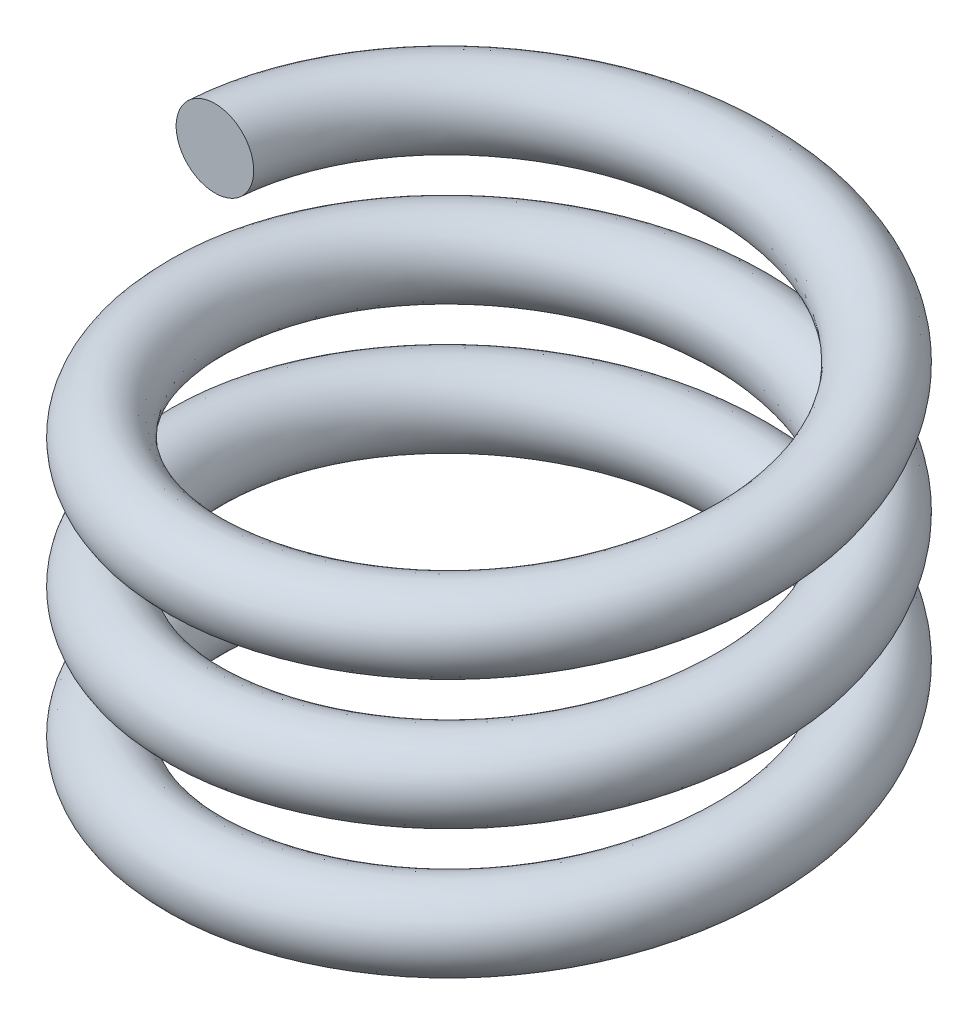
ISO-10303-21;
HEADER;
FILE_DESCRIPTION(('STEP AP214'),'2;1');
FILE_NAME('part.step','',(''),(''),'','','');
FILE_SCHEMA(('AUTOMOTIVE_DESIGN { 1 0 10303 214 1 1 1 1 }'));
ENDSEC;
DATA;
#1=APPLICATION_CONTEXT('core data for automotive mechanical design processes');
#2=APPLICATION_PROTOCOL_DEFINITION('international standard','automotive_design',2000,#1);
#3=PRODUCT_CONTEXT('',#1,'mechanical');
#4=PRODUCT('Part','Part','',(#3));
#5=PRODUCT_RELATED_PRODUCT_CATEGORY('part','',(#4));
#6=PRODUCT_DEFINITION_FORMATION('','',#4);
#7=PRODUCT_DEFINITION_CONTEXT('part definition',#1,'design');
#8=PRODUCT_DEFINITION('design','',#6,#7);
#9=PRODUCT_DEFINITION_SHAPE('','',#8);
#10=(LENGTH_UNIT() NAMED_UNIT(*) SI_UNIT(.MILLI.,.METRE.));
#11=(NAMED_UNIT(*) PLANE_ANGLE_UNIT() SI_UNIT($,.RADIAN.));
#12=(NAMED_UNIT(*) SI_UNIT($,.STERADIAN.) SOLID_ANGLE_UNIT());
#13=UNCERTAINTY_MEASURE_WITH_UNIT(LENGTH_MEASURE(1.E-05),#10,'distance_accuracy_value','');
#14=(GEOMETRIC_REPRESENTATION_CONTEXT(3) GLOBAL_UNCERTAINTY_ASSIGNED_CONTEXT((#13)) GLOBAL_UNIT_ASSIGNED_CONTEXT((#10,
#11,#12)) REPRESENTATION_CONTEXT('',''));
#15=CARTESIAN_POINT('',(0.,0.,0.));
#16=DIRECTION('',(0.,0.,1.));
#17=DIRECTION('',(1.,0.,0.));
#18=AXIS2_PLACEMENT_3D('',#15,#16,#17);
#19=CARTESIAN_POINT('',(-2.6924,0.,0.));
#20=DIRECTION('',(0.,0.,1.));
#21=DIRECTION('',(1.,0.,0.));
#22=AXIS2_PLACEMENT_3D('',#19,#20,#21);
#23=PLANE('',#22);
#24=CARTESIAN_POINT('',(-2.6924,0.,0.));
#25=DIRECTION('',(0.,0.,1.));
#26=DIRECTION('',(1.,0.,0.));
#27=AXIS2_PLACEMENT_3D('',#24,#25,#26);
#28=CIRCLE('',#27,0.381);
#29=CARTESIAN_POINT('',(-2.3114,0.,0.));
#30=VERTEX_POINT('',#29);
#31=EDGE_CURVE('E39',#30,#30,#28,.T.);
#32=ORIENTED_EDGE('',*,*,#31,.F.);
#33=EDGE_LOOP('',(#32));
#34=FACE_BOUND('',#33,.T.);
#35=ADVANCED_FACE('F32',(#34),#23,.F.);
#36=CARTESIAN_POINT('',(-2.6924,3.81,1.12805572280415E-13));
#37=DIRECTION('',(0.,0.,1.));
#38=DIRECTION('',(1.,0.,0.));
#39=AXIS2_PLACEMENT_3D('',#36,#37,#38);
#40=PLANE('',#39);
#41=CARTESIAN_POINT('',(-2.6924,3.81,1.12805572280415E-13));
#42=DIRECTION('',(0.,0.,1.));
#43=DIRECTION('',(1.,0.,0.));
#44=AXIS2_PLACEMENT_3D('',#41,#42,#43);
#45=CIRCLE('',#44,0.381);
#46=CARTESIAN_POINT('',(-2.3114,3.81,0.));
#47=VERTEX_POINT('',#46);
#48=EDGE_CURVE('E11',#47,#47,#45,.T.);
#49=ORIENTED_EDGE('',*,*,#48,.T.);
#50=EDGE_LOOP('',(#49));
#51=FACE_BOUND('',#50,.T.);
#52=ADVANCED_FACE('F46',(#51),#40,.T.);
#53=CARTESIAN_POINT('',(-2.3114,0.,0.));
#54=CARTESIAN_POINT('',(-2.3114,0.105833333333333,1.3344874122049));
#55=CARTESIAN_POINT('',(-1.1557,0.211666666666666,2.00173111830735));
#56=CARTESIAN_POINT('',(0.,0.317499999999999,2.6689748244098));
#57=CARTESIAN_POINT('',(1.1557,0.423333333333332,2.00173111830735));
#58=CARTESIAN_POINT('',(2.3114,0.529166666666665,1.3344874122049));
#59=CARTESIAN_POINT('',(2.3114,0.634999999999998,0.));
#60=CARTESIAN_POINT('',(2.3114,0.740833333333332,-1.3344874122049));
#61=CARTESIAN_POINT('',(1.1557,0.846666666666665,-2.00173111830735));
#62=CARTESIAN_POINT('',(0.,0.952499999999998,-2.6689748244098));
#63=CARTESIAN_POINT('',(-1.1557,1.05833333333333,-2.00173111830735));
#64=CARTESIAN_POINT('',(-2.3114,1.16416666666666,-1.3344874122049));
#65=CARTESIAN_POINT('',(-2.3114,1.27,0.));
#66=CARTESIAN_POINT('',(-2.3114,1.37583333333333,1.3344874122049));
#67=CARTESIAN_POINT('',(-1.1557,1.48166666666666,2.00173111830735));
#68=CARTESIAN_POINT('',(0.,1.5875,2.6689748244098));
#69=CARTESIAN_POINT('',(1.1557,1.69333333333333,2.00173111830735));
#70=CARTESIAN_POINT('',(2.3114,1.79916666666666,1.3344874122049));
#71=CARTESIAN_POINT('',(2.3114,1.905,0.));
#72=CARTESIAN_POINT('',(2.3114,2.01083333333333,-1.3344874122049));
#73=CARTESIAN_POINT('',(1.1557,2.11666666666666,-2.00173111830735));
#74=CARTESIAN_POINT('',(0.,2.22249999999999,-2.6689748244098));
#75=CARTESIAN_POINT('',(-1.1557,2.32833333333333,-2.00173111830735));
#76=CARTESIAN_POINT('',(-2.3114,2.43416666666666,-1.3344874122049));
#77=CARTESIAN_POINT('',(-2.3114,2.53999999999999,0.));
#78=CARTESIAN_POINT('',(-2.3114,2.64583333333333,1.3344874122049));
#79=CARTESIAN_POINT('',(-1.1557,2.75166666666666,2.00173111830735));
#80=CARTESIAN_POINT('',(0.,2.85749999999999,2.6689748244098));
#81=CARTESIAN_POINT('',(1.1557,2.96333333333333,2.00173111830735));
#82=CARTESIAN_POINT('',(2.3114,3.06916666666666,1.3344874122049));
#83=CARTESIAN_POINT('',(2.3114,3.17499999999999,0.));
#84=CARTESIAN_POINT('',(2.3114,3.28083333333333,-1.3344874122049));
#85=CARTESIAN_POINT('',(1.1557,3.38666666666666,-2.00173111830735));
#86=CARTESIAN_POINT('',(0.,3.49249999999999,-2.6689748244098));
#87=CARTESIAN_POINT('',(-1.1557,3.59833333333333,-2.00173111830735));
#88=CARTESIAN_POINT('',(-2.3114,3.70416666666666,-1.3344874122049));
#89=CARTESIAN_POINT('',(-2.3114,3.80999999999999,0.));
#90=CARTESIAN_POINT('',(-2.3114,0.761999999999999,0.));
#91=CARTESIAN_POINT('',(-2.3114,0.867833333333332,1.3344874122049));
#92=CARTESIAN_POINT('',(-1.1557,0.973666666666665,2.00173111830735));
#93=CARTESIAN_POINT('',(0.,1.0795,2.6689748244098));
#94=CARTESIAN_POINT('',(1.1557,1.18533333333333,2.00173111830735));
#95=CARTESIAN_POINT('',(2.3114,1.29116666666667,1.3344874122049));
#96=CARTESIAN_POINT('',(2.3114,1.397,0.));
#97=CARTESIAN_POINT('',(2.3114,1.50283333333333,-1.3344874122049));
#98=CARTESIAN_POINT('',(1.1557,1.60866666666666,-2.00173111830735));
#99=CARTESIAN_POINT('',(0.,1.7145,-2.6689748244098));
#100=CARTESIAN_POINT('',(-1.1557,1.82033333333333,-2.00173111830735));
#101=CARTESIAN_POINT('',(-2.3114,1.92616666666666,-1.3344874122049));
#102=CARTESIAN_POINT('',(-2.3114,2.032,0.));
#103=CARTESIAN_POINT('',(-2.3114,2.13783333333333,1.3344874122049));
#104=CARTESIAN_POINT('',(-1.1557,2.24366666666666,2.00173111830735));
#105=CARTESIAN_POINT('',(0.,2.3495,2.6689748244098));
#106=CARTESIAN_POINT('',(1.1557,2.45533333333333,2.00173111830735));
#107=CARTESIAN_POINT('',(2.3114,2.56116666666666,1.3344874122049));
#108=CARTESIAN_POINT('',(2.3114,2.667,0.));
#109=CARTESIAN_POINT('',(2.3114,2.77283333333333,-1.3344874122049));
#110=CARTESIAN_POINT('',(1.1557,2.87866666666666,-2.00173111830735));
#111=CARTESIAN_POINT('',(0.,2.98449999999999,-2.6689748244098));
#112=CARTESIAN_POINT('',(-1.1557,3.09033333333333,-2.00173111830735));
#113=CARTESIAN_POINT('',(-2.3114,3.19616666666666,-1.3344874122049));
#114=CARTESIAN_POINT('',(-2.3114,3.30199999999999,0.));
#115=CARTESIAN_POINT('',(-2.3114,3.40783333333333,1.3344874122049));
#116=CARTESIAN_POINT('',(-1.1557,3.51366666666666,2.00173111830735));
#117=CARTESIAN_POINT('',(0.,3.61949999999999,2.6689748244098));
#118=CARTESIAN_POINT('',(1.1557,3.72533333333333,2.00173111830735));
#119=CARTESIAN_POINT('',(2.3114,3.83116666666666,1.3344874122049));
#120=CARTESIAN_POINT('',(2.3114,3.93699999999999,0.));
#121=CARTESIAN_POINT('',(2.3114,4.04283333333333,-1.3344874122049));
#122=CARTESIAN_POINT('',(1.1557,4.14866666666666,-2.00173111830735));
#123=CARTESIAN_POINT('',(0.,4.25449999999999,-2.6689748244098));
#124=CARTESIAN_POINT('',(-1.1557,4.36033333333333,-2.00173111830735));
#125=CARTESIAN_POINT('',(-2.3114,4.46616666666666,-1.3344874122049));
#126=CARTESIAN_POINT('',(-2.3114,4.57199999999999,0.));
#127=CARTESIAN_POINT('',(-3.0734,0.761999999999999,0.));
#128=CARTESIAN_POINT('',(-3.0734,0.867833333333332,1.7744283173274));
#129=CARTESIAN_POINT('',(-1.5367,0.973666666666665,2.66164247599109));
#130=CARTESIAN_POINT('',(0.,1.0795,3.54885663465479));
#131=CARTESIAN_POINT('',(1.5367,1.18533333333333,2.66164247599109));
#132=CARTESIAN_POINT('',(3.0734,1.29116666666667,1.7744283173274));
#133=CARTESIAN_POINT('',(3.0734,1.397,0.));
#134=CARTESIAN_POINT('',(3.0734,1.50283333333333,-1.77442831732739));
#135=CARTESIAN_POINT('',(1.5367,1.60866666666666,-2.66164247599109));
#136=CARTESIAN_POINT('',(0.,1.7145,-3.54885663465479));
#137=CARTESIAN_POINT('',(-1.5367,1.82033333333333,-2.66164247599109));
#138=CARTESIAN_POINT('',(-3.0734,1.92616666666666,-1.7744283173274));
#139=CARTESIAN_POINT('',(-3.0734,2.032,0.));
#140=CARTESIAN_POINT('',(-3.0734,2.13783333333333,1.7744283173274));
#141=CARTESIAN_POINT('',(-1.5367,2.24366666666666,2.66164247599109));
#142=CARTESIAN_POINT('',(0.,2.3495,3.54885663465479));
#143=CARTESIAN_POINT('',(1.5367,2.45533333333333,2.66164247599109));
#144=CARTESIAN_POINT('',(3.0734,2.56116666666666,1.7744283173274));
#145=CARTESIAN_POINT('',(3.0734,2.667,0.));
#146=CARTESIAN_POINT('',(3.0734,2.77283333333333,-1.77442831732739));
#147=CARTESIAN_POINT('',(1.5367,2.87866666666666,-2.66164247599109));
#148=CARTESIAN_POINT('',(0.,2.98449999999999,-3.54885663465479));
#149=CARTESIAN_POINT('',(-1.5367,3.09033333333333,-2.66164247599109));
#150=CARTESIAN_POINT('',(-3.0734,3.19616666666666,-1.7744283173274));
#151=CARTESIAN_POINT('',(-3.0734,3.30199999999999,0.));
#152=CARTESIAN_POINT('',(-3.0734,3.40783333333333,1.7744283173274));
#153=CARTESIAN_POINT('',(-1.5367,3.51366666666666,2.66164247599109));
#154=CARTESIAN_POINT('',(0.,3.61949999999999,3.54885663465479));
#155=CARTESIAN_POINT('',(1.5367,3.72533333333333,2.66164247599109));
#156=CARTESIAN_POINT('',(3.0734,3.83116666666666,1.7744283173274));
#157=CARTESIAN_POINT('',(3.0734,3.93699999999999,0.));
#158=CARTESIAN_POINT('',(3.0734,4.04283333333333,-1.77442831732739));
#159=CARTESIAN_POINT('',(1.5367,4.14866666666666,-2.66164247599109));
#160=CARTESIAN_POINT('',(0.,4.25449999999999,-3.54885663465479));
#161=CARTESIAN_POINT('',(-1.5367,4.36033333333333,-2.66164247599109));
#162=CARTESIAN_POINT('',(-3.0734,4.46616666666666,-1.7744283173274));
#163=CARTESIAN_POINT('',(-3.0734,4.57199999999999,0.));
#164=CARTESIAN_POINT('',(-3.0734,0.,0.));
#165=CARTESIAN_POINT('',(-3.0734,0.105833333333333,1.77442831732739));
#166=CARTESIAN_POINT('',(-1.5367,0.211666666666666,2.66164247599109));
#167=CARTESIAN_POINT('',(0.,0.317499999999999,3.54885663465479));
#168=CARTESIAN_POINT('',(1.5367,0.423333333333332,2.66164247599109));
#169=CARTESIAN_POINT('',(3.0734,0.529166666666665,1.7744283173274));
#170=CARTESIAN_POINT('',(3.0734,0.634999999999998,0.));
#171=CARTESIAN_POINT('',(3.0734,0.740833333333332,-1.77442831732739));
#172=CARTESIAN_POINT('',(1.5367,0.846666666666665,-2.66164247599109));
#173=CARTESIAN_POINT('',(0.,0.952499999999998,-3.54885663465479));
#174=CARTESIAN_POINT('',(-1.5367,1.05833333333333,-2.66164247599109));
#175=CARTESIAN_POINT('',(-3.0734,1.16416666666666,-1.7744283173274));
#176=CARTESIAN_POINT('',(-3.0734,1.27,0.));
#177=CARTESIAN_POINT('',(-3.0734,1.37583333333333,1.77442831732739));
#178=CARTESIAN_POINT('',(-1.5367,1.48166666666666,2.66164247599109));
#179=CARTESIAN_POINT('',(0.,1.5875,3.54885663465479));
#180=CARTESIAN_POINT('',(1.5367,1.69333333333333,2.66164247599109));
#181=CARTESIAN_POINT('',(3.0734,1.79916666666666,1.7744283173274));
#182=CARTESIAN_POINT('',(3.0734,1.905,0.));
#183=CARTESIAN_POINT('',(3.0734,2.01083333333333,-1.77442831732739));
#184=CARTESIAN_POINT('',(1.5367,2.11666666666666,-2.66164247599109));
#185=CARTESIAN_POINT('',(0.,2.22249999999999,-3.54885663465479));
#186=CARTESIAN_POINT('',(-1.5367,2.32833333333333,-2.66164247599109));
#187=CARTESIAN_POINT('',(-3.0734,2.43416666666666,-1.7744283173274));
#188=CARTESIAN_POINT('',(-3.0734,2.53999999999999,0.));
#189=CARTESIAN_POINT('',(-3.0734,2.64583333333333,1.77442831732739));
#190=CARTESIAN_POINT('',(-1.5367,2.75166666666666,2.66164247599109));
#191=CARTESIAN_POINT('',(0.,2.85749999999999,3.54885663465479));
#192=CARTESIAN_POINT('',(1.5367,2.96333333333333,2.66164247599109));
#193=CARTESIAN_POINT('',(3.0734,3.06916666666666,1.7744283173274));
#194=CARTESIAN_POINT('',(3.0734,3.17499999999999,0.));
#195=CARTESIAN_POINT('',(3.0734,3.28083333333333,-1.77442831732739));
#196=CARTESIAN_POINT('',(1.5367,3.38666666666666,-2.66164247599109));
#197=CARTESIAN_POINT('',(0.,3.49249999999999,-3.54885663465479));
#198=CARTESIAN_POINT('',(-1.5367,3.59833333333333,-2.66164247599109));
#199=CARTESIAN_POINT('',(-3.0734,3.70416666666666,-1.7744283173274));
#200=CARTESIAN_POINT('',(-3.0734,3.80999999999999,0.));
#201=CARTESIAN_POINT('',(-3.0734,-0.762,0.));
#202=CARTESIAN_POINT('',(-3.0734,-0.656166666666667,1.7744283173274));
#203=CARTESIAN_POINT('',(-1.5367,-0.550333333333334,2.66164247599109));
#204=CARTESIAN_POINT('',(0.,-0.4445,3.54885663465479));
#205=CARTESIAN_POINT('',(1.5367,-0.338666666666667,2.66164247599109));
#206=CARTESIAN_POINT('',(3.0734,-0.232833333333334,1.7744283173274));
#207=CARTESIAN_POINT('',(3.0734,-0.127000000000001,0.));
#208=CARTESIAN_POINT('',(3.0734,-0.0211666666666679,-1.77442831732739));
#209=CARTESIAN_POINT('',(1.5367,0.0846666666666652,-2.66164247599109));
#210=CARTESIAN_POINT('',(0.,0.190499999999998,-3.54885663465479));
#211=CARTESIAN_POINT('',(-1.5367,0.296333333333332,-2.66164247599109));
#212=CARTESIAN_POINT('',(-3.0734,0.402166666666665,-1.7744283173274));
#213=CARTESIAN_POINT('',(-3.0734,0.507999999999998,0.));
#214=CARTESIAN_POINT('',(-3.0734,0.613833333333331,1.7744283173274));
#215=CARTESIAN_POINT('',(-1.5367,0.719666666666664,2.66164247599109));
#216=CARTESIAN_POINT('',(0.,0.825499999999997,3.54885663465479));
#217=CARTESIAN_POINT('',(1.5367,0.93133333333333,2.66164247599109));
#218=CARTESIAN_POINT('',(3.0734,1.03716666666666,1.7744283173274));
#219=CARTESIAN_POINT('',(3.0734,1.143,0.));
#220=CARTESIAN_POINT('',(3.0734,1.24883333333333,-1.77442831732739));
#221=CARTESIAN_POINT('',(1.5367,1.35466666666666,-2.66164247599109));
#222=CARTESIAN_POINT('',(0.,1.4605,-3.54885663465479));
#223=CARTESIAN_POINT('',(-1.5367,1.56633333333333,-2.66164247599109));
#224=CARTESIAN_POINT('',(-3.0734,1.67216666666666,-1.7744283173274));
#225=CARTESIAN_POINT('',(-3.0734,1.778,0.));
#226=CARTESIAN_POINT('',(-3.0734,1.88383333333333,1.7744283173274));
#227=CARTESIAN_POINT('',(-1.5367,1.98966666666666,2.66164247599109));
#228=CARTESIAN_POINT('',(0.,2.09549999999999,3.54885663465479));
#229=CARTESIAN_POINT('',(1.5367,2.20133333333333,2.66164247599109));
#230=CARTESIAN_POINT('',(3.0734,2.30716666666666,1.7744283173274));
#231=CARTESIAN_POINT('',(3.0734,2.41299999999999,0.));
#232=CARTESIAN_POINT('',(3.0734,2.51883333333333,-1.77442831732739));
#233=CARTESIAN_POINT('',(1.5367,2.62466666666666,-2.66164247599109));
#234=CARTESIAN_POINT('',(0.,2.73049999999999,-3.54885663465479));
#235=CARTESIAN_POINT('',(-1.5367,2.83633333333333,-2.66164247599109));
#236=CARTESIAN_POINT('',(-3.0734,2.94216666666666,-1.7744283173274));
#237=CARTESIAN_POINT('',(-3.0734,3.04799999999999,0.));
#238=CARTESIAN_POINT('',(-2.3114,-0.762,0.));
#239=CARTESIAN_POINT('',(-2.3114,-0.656166666666667,1.3344874122049));
#240=CARTESIAN_POINT('',(-1.1557,-0.550333333333334,2.00173111830735));
#241=CARTESIAN_POINT('',(0.,-0.4445,2.6689748244098));
#242=CARTESIAN_POINT('',(1.1557,-0.338666666666667,2.00173111830735));
#243=CARTESIAN_POINT('',(2.3114,-0.232833333333334,1.3344874122049));
#244=CARTESIAN_POINT('',(2.3114,-0.127000000000001,0.));
#245=CARTESIAN_POINT('',(2.3114,-0.0211666666666679,-1.3344874122049));
#246=CARTESIAN_POINT('',(1.1557,0.0846666666666652,-2.00173111830735));
#247=CARTESIAN_POINT('',(0.,0.190499999999998,-2.6689748244098));
#248=CARTESIAN_POINT('',(-1.1557,0.296333333333332,-2.00173111830735));
#249=CARTESIAN_POINT('',(-2.3114,0.402166666666665,-1.3344874122049));
#250=CARTESIAN_POINT('',(-2.3114,0.507999999999998,0.));
#251=CARTESIAN_POINT('',(-2.3114,0.613833333333331,1.3344874122049));
#252=CARTESIAN_POINT('',(-1.1557,0.719666666666664,2.00173111830735));
#253=CARTESIAN_POINT('',(0.,0.825499999999997,2.6689748244098));
#254=CARTESIAN_POINT('',(1.1557,0.93133333333333,2.00173111830735));
#255=CARTESIAN_POINT('',(2.3114,1.03716666666666,1.3344874122049));
#256=CARTESIAN_POINT('',(2.3114,1.143,0.));
#257=CARTESIAN_POINT('',(2.3114,1.24883333333333,-1.3344874122049));
#258=CARTESIAN_POINT('',(1.1557,1.35466666666666,-2.00173111830735));
#259=CARTESIAN_POINT('',(0.,1.4605,-2.6689748244098));
#260=CARTESIAN_POINT('',(-1.1557,1.56633333333333,-2.00173111830735));
#261=CARTESIAN_POINT('',(-2.3114,1.67216666666666,-1.3344874122049));
#262=CARTESIAN_POINT('',(-2.3114,1.778,0.));
#263=CARTESIAN_POINT('',(-2.3114,1.88383333333333,1.3344874122049));
#264=CARTESIAN_POINT('',(-1.1557,1.98966666666666,2.00173111830735));
#265=CARTESIAN_POINT('',(0.,2.09549999999999,2.6689748244098));
#266=CARTESIAN_POINT('',(1.1557,2.20133333333333,2.00173111830735));
#267=CARTESIAN_POINT('',(2.3114,2.30716666666666,1.3344874122049));
#268=CARTESIAN_POINT('',(2.3114,2.41299999999999,0.));
#269=CARTESIAN_POINT('',(2.3114,2.51883333333333,-1.3344874122049));
#270=CARTESIAN_POINT('',(1.1557,2.62466666666666,-2.00173111830735));
#271=CARTESIAN_POINT('',(0.,2.73049999999999,-2.6689748244098));
#272=CARTESIAN_POINT('',(-1.1557,2.83633333333333,-2.00173111830735));
#273=CARTESIAN_POINT('',(-2.3114,2.94216666666666,-1.3344874122049));
#274=CARTESIAN_POINT('',(-2.3114,3.04799999999999,0.));
#275=CARTESIAN_POINT('',(-2.3114,0.,0.));
#276=CARTESIAN_POINT('',(-2.3114,0.105833333333333,1.3344874122049));
#277=CARTESIAN_POINT('',(-1.1557,0.211666666666666,2.00173111830735));
#278=CARTESIAN_POINT('',(0.,0.317499999999999,2.6689748244098));
#279=CARTESIAN_POINT('',(1.1557,0.423333333333332,2.00173111830735));
#280=CARTESIAN_POINT('',(2.3114,0.529166666666665,1.3344874122049));
#281=CARTESIAN_POINT('',(2.3114,0.634999999999998,0.));
#282=CARTESIAN_POINT('',(2.3114,0.740833333333332,-1.3344874122049));
#283=CARTESIAN_POINT('',(1.1557,0.846666666666665,-2.00173111830735));
#284=CARTESIAN_POINT('',(0.,0.952499999999998,-2.6689748244098));
#285=CARTESIAN_POINT('',(-1.1557,1.05833333333333,-2.00173111830735));
#286=CARTESIAN_POINT('',(-2.3114,1.16416666666666,-1.3344874122049));
#287=CARTESIAN_POINT('',(-2.3114,1.27,0.));
#288=CARTESIAN_POINT('',(-2.3114,1.37583333333333,1.3344874122049));
#289=CARTESIAN_POINT('',(-1.1557,1.48166666666666,2.00173111830735));
#290=CARTESIAN_POINT('',(0.,1.5875,2.6689748244098));
#291=CARTESIAN_POINT('',(1.1557,1.69333333333333,2.00173111830735));
#292=CARTESIAN_POINT('',(2.3114,1.79916666666666,1.3344874122049));
#293=CARTESIAN_POINT('',(2.3114,1.905,0.));
#294=CARTESIAN_POINT('',(2.3114,2.01083333333333,-1.3344874122049));
#295=CARTESIAN_POINT('',(1.1557,2.11666666666666,-2.00173111830735));
#296=CARTESIAN_POINT('',(0.,2.22249999999999,-2.6689748244098));
#297=CARTESIAN_POINT('',(-1.1557,2.32833333333333,-2.00173111830735));
#298=CARTESIAN_POINT('',(-2.3114,2.43416666666666,-1.3344874122049));
#299=CARTESIAN_POINT('',(-2.3114,2.53999999999999,0.));
#300=CARTESIAN_POINT('',(-2.3114,2.64583333333333,1.3344874122049));
#301=CARTESIAN_POINT('',(-1.1557,2.75166666666666,2.00173111830735));
#302=CARTESIAN_POINT('',(0.,2.85749999999999,2.6689748244098));
#303=CARTESIAN_POINT('',(1.1557,2.96333333333333,2.00173111830735));
#304=CARTESIAN_POINT('',(2.3114,3.06916666666666,1.3344874122049));
#305=CARTESIAN_POINT('',(2.3114,3.17499999999999,0.));
#306=CARTESIAN_POINT('',(2.3114,3.28083333333333,-1.3344874122049));
#307=CARTESIAN_POINT('',(1.1557,3.38666666666666,-2.00173111830735));
#308=CARTESIAN_POINT('',(0.,3.49249999999999,-2.6689748244098));
#309=CARTESIAN_POINT('',(-1.1557,3.59833333333333,-2.00173111830735));
#310=CARTESIAN_POINT('',(-2.3114,3.70416666666666,-1.3344874122049));
#311=CARTESIAN_POINT('',(-2.3114,3.80999999999999,0.));
#312=(BOUNDED_SURFACE() B_SPLINE_SURFACE(3,2,((#53,#54,#55,#56,#57,#58,#59,#60,#61,#62,#63,#64,
#65,#66,#67,#68,#69,#70,#71,#72,#73,#74,#75,#76,#77,#78,#79,#80,#81,#82,#83,#84,#85,#86,#87,#88,
#89),(#90,#91,#92,#93,#94,#95,#96,#97,#98,#99,#100,#101,#102,#103,#104,#105,#106,#107,#108,#109,
#110,#111,#112,#113,#114,#115,#116,#117,#118,#119,#120,#121,#122,#123,#124,#125,#126),(#127,
#128,#129,#130,#131,#132,#133,#134,#135,#136,#137,#138,#139,#140,#141,#142,#143,#144,#145,#146,
#147,#148,#149,#150,#151,#152,#153,#154,#155,#156,#157,#158,#159,#160,#161,#162,#163),(#164,
#165,#166,#167,#168,#169,#170,#171,#172,#173,#174,#175,#176,#177,#178,#179,#180,#181,#182,#183,
#184,#185,#186,#187,#188,#189,#190,#191,#192,#193,#194,#195,#196,#197,#198,#199,#200),(#201,
#202,#203,#204,#205,#206,#207,#208,#209,#210,#211,#212,#213,#214,#215,#216,#217,#218,#219,#220,
#221,#222,#223,#224,#225,#226,#227,#228,#229,#230,#231,#232,#233,#234,#235,#236,#237),(#238,
#239,#240,#241,#242,#243,#244,#245,#246,#247,#248,#249,#250,#251,#252,#253,#254,#255,#256,#257,
#258,#259,#260,#261,#262,#263,#264,#265,#266,#267,#268,#269,#270,#271,#272,#273,#274),(#275,
#276,#277,#278,#279,#280,#281,#282,#283,#284,#285,#286,#287,#288,#289,#290,#291,#292,#293,#294,
#295,#296,#297,#298,#299,#300,#301,#302,#303,#304,#305,#306,#307,#308,#309,#310,#311)),
.UNSPECIFIED.,.T.,.F.,.F.) B_SPLINE_SURFACE_WITH_KNOTS((4,3,4),(3,2,2,2,2,2,2,2,2,2,2,2,2,2,2,2,
2,2,3),(0.,0.5,1.),(0.,0.0555555555555556,0.111111111111111,0.166666666666667,0.222222222222222,
0.277777777777778,0.333333333333333,0.388888888888889,0.444444444444444,0.5,0.555555555555556,
0.611111111111111,0.666666666666667,0.722222222222222,0.777777777777778,0.833333333333333,
0.888888888888889,0.944444444444444,1.),
.UNSPECIFIED.) GEOMETRIC_REPRESENTATION_ITEM() RATIONAL_B_SPLINE_SURFACE(((1.,0.866025403784439,
1.,0.866025403784439,1.,0.866025403784439,1.,0.866025403784439,1.,0.866025403784439,1.,
0.866025403784439,1.,0.866025403784439,1.,0.866025403784439,1.,0.866025403784439,1.,
0.866025403784439,1.,0.866025403784439,1.,0.866025403784439,1.,0.866025403784439,1.,
0.866025403784439,1.,0.866025403784439,1.,0.866025403784439,1.,0.866025403784439,1.,
0.866025403784439,1.),(0.333333333333333,0.288675134594813,0.333333333333333,0.288675134594813,
0.333333333333333,0.288675134594813,0.333333333333333,0.288675134594813,0.333333333333333,
0.288675134594813,0.333333333333333,0.288675134594813,0.333333333333333,0.288675134594813,
0.333333333333333,0.288675134594813,0.333333333333333,0.288675134594813,0.333333333333333,
0.288675134594813,0.333333333333333,0.288675134594813,0.333333333333333,0.288675134594813,
0.333333333333333,0.288675134594813,0.333333333333333,0.288675134594813,0.333333333333333,
0.288675134594813,0.333333333333333,0.288675134594813,0.333333333333333,0.288675134594813,
0.333333333333333,0.288675134594813,0.333333333333333),(0.333333333333333,0.288675134594813,
0.333333333333333,0.288675134594813,0.333333333333333,0.288675134594813,0.333333333333333,
0.288675134594813,0.333333333333333,0.288675134594813,0.333333333333333,0.288675134594813,
0.333333333333333,0.288675134594813,0.333333333333333,0.288675134594813,0.333333333333333,
0.288675134594813,0.333333333333333,0.288675134594813,0.333333333333333,0.288675134594813,
0.333333333333333,0.288675134594813,0.333333333333333,0.288675134594813,0.333333333333333,
0.288675134594813,0.333333333333333,0.288675134594813,0.333333333333333,0.288675134594813,
0.333333333333333,0.288675134594813,0.333333333333333,0.288675134594813,0.333333333333333),(1.,
0.866025403784439,1.,0.866025403784439,1.,0.866025403784439,1.,0.866025403784439,1.,
0.866025403784439,1.,0.866025403784439,1.,0.866025403784439,1.,0.866025403784439,1.,
0.866025403784439,1.,0.866025403784439,1.,0.866025403784439,1.,0.866025403784439,1.,
0.866025403784439,1.,0.866025403784439,1.,0.866025403784439,1.,0.866025403784439,1.,
0.866025403784439,1.,0.866025403784439,1.),(0.333333333333333,0.288675134594813,
0.333333333333333,0.288675134594813,0.333333333333333,0.288675134594813,0.333333333333333,
0.288675134594813,0.333333333333333,0.288675134594813,0.333333333333333,0.288675134594813,
0.333333333333333,0.288675134594813,0.333333333333333,0.288675134594813,0.333333333333333,
0.288675134594813,0.333333333333333,0.288675134594813,0.333333333333333,0.288675134594813,
0.333333333333333,0.288675134594813,0.333333333333333,0.288675134594813,0.333333333333333,
0.288675134594813,0.333333333333333,0.288675134594813,0.333333333333333,0.288675134594813,
0.333333333333333,0.288675134594813,0.333333333333333,0.288675134594813,0.333333333333333),
(0.333333333333333,0.288675134594813,0.333333333333333,0.288675134594813,0.333333333333333,
0.288675134594813,0.333333333333333,0.288675134594813,0.333333333333333,0.288675134594813,
0.333333333333333,0.288675134594813,0.333333333333333,0.288675134594813,0.333333333333333,
0.288675134594813,0.333333333333333,0.288675134594813,0.333333333333333,0.288675134594813,
0.333333333333333,0.288675134594813,0.333333333333333,0.288675134594813,0.333333333333333,
0.288675134594813,0.333333333333333,0.288675134594813,0.333333333333333,0.288675134594813,
0.333333333333333,0.288675134594813,0.333333333333333,0.288675134594813,0.333333333333333,
0.288675134594813,0.333333333333333),(1.,0.866025403784439,1.,0.866025403784439,1.,
0.866025403784439,1.,0.866025403784439,1.,0.866025403784439,1.,0.866025403784439,1.,
0.866025403784439,1.,0.866025403784439,1.,0.866025403784439,1.,0.866025403784439,1.,
0.866025403784439,1.,0.866025403784439,1.,0.866025403784439,1.,0.866025403784439,1.,
0.866025403784439,1.,0.866025403784439,1.,0.866025403784439,1.,0.866025403784439,1.))) REPRESENTATION_ITEM('') SURFACE());
#313=ORIENTED_EDGE('',*,*,#48,.F.);
#314=EDGE_LOOP('',(#313));
#315=FACE_BOUND('',#314,.T.);
#316=ORIENTED_EDGE('',*,*,#31,.T.);
#317=EDGE_LOOP('',(#316));
#318=FACE_BOUND('',#317,.T.);
#319=ADVANCED_FACE('F48',(#315,#318),#312,.T.);
#320=CLOSED_SHELL('',(#35,#52,#319));
#321=MANIFOLD_SOLID_BREP('B2',#320);
#322=ADVANCED_BREP_SHAPE_REPRESENTATION('',(#18,#321),#14);
#323=SHAPE_DEFINITION_REPRESENTATION(#9,#322);
ENDSEC;
END-ISO-10303-21;
